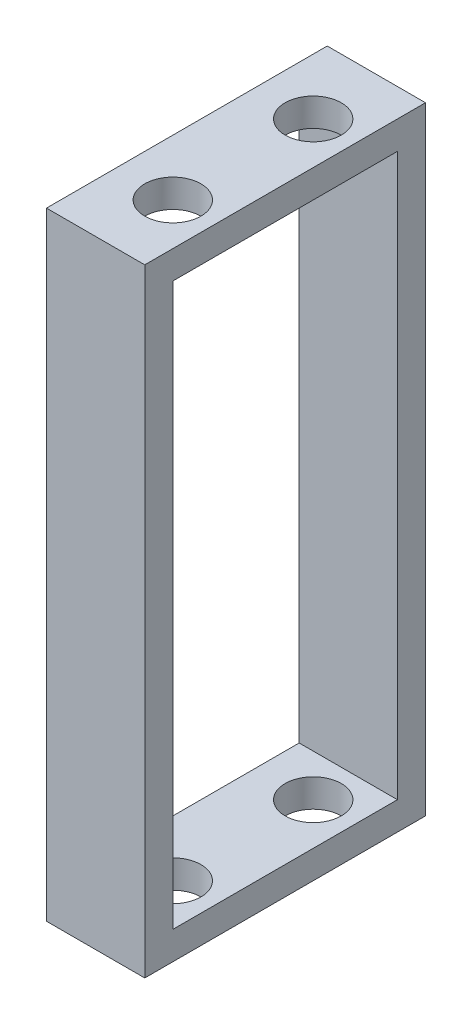
ISO-10303-21;
HEADER;
FILE_DESCRIPTION(('STEP AP214'),'2;1');
FILE_NAME('part.step','',(''),(''),'','','');
FILE_SCHEMA(('AUTOMOTIVE_DESIGN { 1 0 10303 214 1 1 1 1 }'));
ENDSEC;
DATA;
#1=APPLICATION_CONTEXT('core data for automotive mechanical design processes');
#2=APPLICATION_PROTOCOL_DEFINITION('international standard','automotive_design',2000,#1);
#3=PRODUCT_CONTEXT('',#1,'mechanical');
#4=PRODUCT('Part','Part','',(#3));
#5=PRODUCT_RELATED_PRODUCT_CATEGORY('part','',(#4));
#6=PRODUCT_DEFINITION_FORMATION('','',#4);
#7=PRODUCT_DEFINITION_CONTEXT('part definition',#1,'design');
#8=PRODUCT_DEFINITION('design','',#6,#7);
#9=PRODUCT_DEFINITION_SHAPE('','',#8);
#10=(LENGTH_UNIT() NAMED_UNIT(*) SI_UNIT(.MILLI.,.METRE.));
#11=(NAMED_UNIT(*) PLANE_ANGLE_UNIT() SI_UNIT($,.RADIAN.));
#12=(NAMED_UNIT(*) SI_UNIT($,.STERADIAN.) SOLID_ANGLE_UNIT());
#13=UNCERTAINTY_MEASURE_WITH_UNIT(LENGTH_MEASURE(1.E-05),#10,'distance_accuracy_value','');
#14=(GEOMETRIC_REPRESENTATION_CONTEXT(3) GLOBAL_UNCERTAINTY_ASSIGNED_CONTEXT((#13)) GLOBAL_UNIT_ASSIGNED_CONTEXT((#10,
#11,#12)) REPRESENTATION_CONTEXT('',''));
#15=CARTESIAN_POINT('',(0.,0.,0.));
#16=DIRECTION('',(0.,0.,1.));
#17=DIRECTION('',(1.,0.,0.));
#18=AXIS2_PLACEMENT_3D('',#15,#16,#17);
#19=CARTESIAN_POINT('',(7.,44.,10.));
#20=DIRECTION('',(0.,-1.,0.));
#21=DIRECTION('',(0.,0.,-1.));
#22=AXIS2_PLACEMENT_3D('',#19,#20,#21);
#23=PLANE('',#22);
#24=CARTESIAN_POINT('',(4.,44.,-5.));
#25=DIRECTION('',(0.,1.,0.));
#26=DIRECTION('',(0.,0.,1.));
#27=AXIS2_PLACEMENT_3D('',#24,#25,#26);
#28=CIRCLE('',#27,2.);
#29=CARTESIAN_POINT('',(4.,44.,-3.));
#30=VERTEX_POINT('',#29);
#31=EDGE_CURVE('E163',#30,#30,#28,.T.);
#32=ORIENTED_EDGE('',*,*,#31,.F.);
#33=EDGE_LOOP('',(#32));
#34=FACE_BOUND('',#33,.T.);
#35=CARTESIAN_POINT('',(4.,44.,5.));
#36=DIRECTION('',(0.,1.,0.));
#37=DIRECTION('',(0.,0.,1.));
#38=AXIS2_PLACEMENT_3D('',#35,#36,#37);
#39=CIRCLE('',#38,2.);
#40=CARTESIAN_POINT('',(4.,44.,7.));
#41=VERTEX_POINT('',#40);
#42=EDGE_CURVE('E170',#41,#41,#39,.T.);
#43=ORIENTED_EDGE('',*,*,#42,.F.);
#44=EDGE_LOOP('',(#43));
#45=FACE_BOUND('',#44,.T.);
#46=DIRECTION('',(-1.,0.,0.));
#47=VECTOR('',#46,1.);
#48=CARTESIAN_POINT('',(7.,44.,-10.));
#49=LINE('',#48,#47);
#50=CARTESIAN_POINT('',(7.,44.,-10.));
#51=VERTEX_POINT('',#50);
#52=CARTESIAN_POINT('',(0.,44.,-10.));
#53=VERTEX_POINT('',#52);
#54=EDGE_CURVE('E120',#51,#53,#49,.T.);
#55=ORIENTED_EDGE('',*,*,#54,.T.);
#56=DIRECTION('',(0.,0.,-1.));
#57=VECTOR('',#56,1.);
#58=CARTESIAN_POINT('',(0.,44.,10.));
#59=LINE('',#58,#57);
#60=CARTESIAN_POINT('',(0.,44.,10.));
#61=VERTEX_POINT('',#60);
#62=EDGE_CURVE('E151',#61,#53,#59,.T.);
#63=ORIENTED_EDGE('',*,*,#62,.F.);
#64=DIRECTION('',(-1.,0.,0.));
#65=VECTOR('',#64,1.);
#66=CARTESIAN_POINT('',(7.,44.,10.));
#67=LINE('',#66,#65);
#68=CARTESIAN_POINT('',(7.,44.,10.));
#69=VERTEX_POINT('',#68);
#70=EDGE_CURVE('E128',#69,#61,#67,.T.);
#71=ORIENTED_EDGE('',*,*,#70,.F.);
#72=DIRECTION('',(0.,0.,-1.));
#73=VECTOR('',#72,1.);
#74=CARTESIAN_POINT('',(7.,44.,10.));
#75=LINE('',#74,#73);
#76=EDGE_CURVE('E137',#69,#51,#75,.T.);
#77=ORIENTED_EDGE('',*,*,#76,.T.);
#78=EDGE_LOOP('',(#55,#63,#71,#77));
#79=FACE_BOUND('',#78,.T.);
#80=ADVANCED_FACE('F37',(#34,#45,#79),#23,.F.);
#81=CARTESIAN_POINT('',(0.,2.,10.));
#82=DIRECTION('',(1.,0.,0.));
#83=DIRECTION('',(0.,0.,-1.));
#84=AXIS2_PLACEMENT_3D('',#81,#82,#83);
#85=PLANE('',#84);
#86=DIRECTION('',(0.,0.,-1.));
#87=VECTOR('',#86,1.);
#88=CARTESIAN_POINT('',(0.,2.,10.));
#89=LINE('',#88,#87);
#90=CARTESIAN_POINT('',(0.,2.,8.));
#91=VERTEX_POINT('',#90);
#92=CARTESIAN_POINT('',(0.,2.,-8.00000000000001));
#93=VERTEX_POINT('',#92);
#94=EDGE_CURVE('E119',#91,#93,#89,.T.);
#95=ORIENTED_EDGE('',*,*,#94,.T.);
#96=DIRECTION('',(0.,1.,0.));
#97=VECTOR('',#96,1.);
#98=CARTESIAN_POINT('',(0.,2.00000000000001,-8.00000000000001));
#99=LINE('',#98,#97);
#100=CARTESIAN_POINT('',(0.,42.,-8.));
#101=VERTEX_POINT('',#100);
#102=EDGE_CURVE('E111',#93,#101,#99,.T.);
#103=ORIENTED_EDGE('',*,*,#102,.T.);
#104=DIRECTION('',(0.,0.,1.));
#105=VECTOR('',#104,1.);
#106=CARTESIAN_POINT('',(0.,42.,10.));
#107=LINE('',#106,#105);
#108=CARTESIAN_POINT('',(0.,42.,8.00000000000001));
#109=VERTEX_POINT('',#108);
#110=EDGE_CURVE('E100',#101,#109,#107,.T.);
#111=ORIENTED_EDGE('',*,*,#110,.T.);
#112=DIRECTION('',(0.,-1.,0.));
#113=VECTOR('',#112,1.);
#114=CARTESIAN_POINT('',(0.,2.,8.));
#115=LINE('',#114,#113);
#116=EDGE_CURVE('E105',#109,#91,#115,.T.);
#117=ORIENTED_EDGE('',*,*,#116,.T.);
#118=EDGE_LOOP('',(#95,#103,#111,#117));
#119=FACE_BOUND('',#118,.T.);
#120=DIRECTION('',(0.,-1.,0.));
#121=VECTOR('',#120,1.);
#122=CARTESIAN_POINT('',(0.,2.,-10.));
#123=LINE('',#122,#121);
#124=CARTESIAN_POINT('',(0.,0.,-10.));
#125=VERTEX_POINT('',#124);
#126=EDGE_CURVE('E123',#53,#125,#123,.T.);
#127=ORIENTED_EDGE('',*,*,#126,.T.);
#128=DIRECTION('',(0.,0.,-1.));
#129=VECTOR('',#128,1.);
#130=CARTESIAN_POINT('',(0.,0.,10.));
#131=LINE('',#130,#129);
#132=CARTESIAN_POINT('',(0.,0.,10.));
#133=VERTEX_POINT('',#132);
#134=EDGE_CURVE('E148',#133,#125,#131,.T.);
#135=ORIENTED_EDGE('',*,*,#134,.F.);
#136=DIRECTION('',(0.,-1.,0.));
#137=VECTOR('',#136,1.);
#138=CARTESIAN_POINT('',(0.,44.,10.));
#139=LINE('',#138,#137);
#140=EDGE_CURVE('E131',#61,#133,#139,.T.);
#141=ORIENTED_EDGE('',*,*,#140,.F.);
#142=ORIENTED_EDGE('',*,*,#62,.T.);
#143=EDGE_LOOP('',(#127,#135,#141,#142));
#144=FACE_BOUND('',#143,.T.);
#145=ADVANCED_FACE('F117',(#119,#144),#85,.F.);
#146=CARTESIAN_POINT('',(0.,0.,10.));
#147=DIRECTION('',(0.,1.,0.));
#148=DIRECTION('',(0.,0.,1.));
#149=AXIS2_PLACEMENT_3D('',#146,#147,#148);
#150=PLANE('',#149);
#151=CARTESIAN_POINT('',(4.,0.,-5.));
#152=DIRECTION('',(0.,1.,0.));
#153=DIRECTION('',(0.,0.,1.));
#154=AXIS2_PLACEMENT_3D('',#151,#152,#153);
#155=CIRCLE('',#154,2.);
#156=CARTESIAN_POINT('',(4.,0.,-3.));
#157=VERTEX_POINT('',#156);
#158=EDGE_CURVE('E114',#157,#157,#155,.T.);
#159=ORIENTED_EDGE('',*,*,#158,.T.);
#160=EDGE_LOOP('',(#159));
#161=FACE_BOUND('',#160,.T.);
#162=CARTESIAN_POINT('',(4.,0.,5.));
#163=DIRECTION('',(0.,1.,0.));
#164=DIRECTION('',(0.,0.,1.));
#165=AXIS2_PLACEMENT_3D('',#162,#163,#164);
#166=CIRCLE('',#165,2.);
#167=CARTESIAN_POINT('',(4.,0.,7.));
#168=VERTEX_POINT('',#167);
#169=EDGE_CURVE('E167',#168,#168,#166,.T.);
#170=ORIENTED_EDGE('',*,*,#169,.T.);
#171=EDGE_LOOP('',(#170));
#172=FACE_BOUND('',#171,.T.);
#173=DIRECTION('',(1.,0.,0.));
#174=VECTOR('',#173,1.);
#175=CARTESIAN_POINT('',(0.,0.,-10.));
#176=LINE('',#175,#174);
#177=CARTESIAN_POINT('',(7.,0.,-10.));
#178=VERTEX_POINT('',#177);
#179=EDGE_CURVE('E140',#125,#178,#176,.T.);
#180=ORIENTED_EDGE('',*,*,#179,.T.);
#181=DIRECTION('',(0.,0.,-1.));
#182=VECTOR('',#181,1.);
#183=CARTESIAN_POINT('',(7.,0.,10.));
#184=LINE('',#183,#182);
#185=CARTESIAN_POINT('',(7.,0.,10.));
#186=VERTEX_POINT('',#185);
#187=EDGE_CURVE('E145',#186,#178,#184,.T.);
#188=ORIENTED_EDGE('',*,*,#187,.F.);
#189=DIRECTION('',(1.,0.,0.));
#190=VECTOR('',#189,1.);
#191=CARTESIAN_POINT('',(0.,0.,10.));
#192=LINE('',#191,#190);
#193=EDGE_CURVE('E134',#133,#186,#192,.T.);
#194=ORIENTED_EDGE('',*,*,#193,.F.);
#195=ORIENTED_EDGE('',*,*,#134,.T.);
#196=EDGE_LOOP('',(#180,#188,#194,#195));
#197=FACE_BOUND('',#196,.T.);
#198=ADVANCED_FACE('F198',(#161,#172,#197),#150,.F.);
#199=CARTESIAN_POINT('',(7.,0.,10.));
#200=DIRECTION('',(-1.,0.,0.));
#201=DIRECTION('',(0.,-1.,0.));
#202=AXIS2_PLACEMENT_3D('',#199,#200,#201);
#203=PLANE('',#202);
#204=DIRECTION('',(0.,0.,-1.));
#205=VECTOR('',#204,1.);
#206=CARTESIAN_POINT('',(7.,42.,10.));
#207=LINE('',#206,#205);
#208=CARTESIAN_POINT('',(7.,42.,8.00000000000001));
#209=VERTEX_POINT('',#208);
#210=CARTESIAN_POINT('',(7.,42.,-7.99999999999999));
#211=VERTEX_POINT('',#210);
#212=EDGE_CURVE('E154',#209,#211,#207,.T.);
#213=ORIENTED_EDGE('',*,*,#212,.T.);
#214=DIRECTION('',(0.,-1.,0.));
#215=VECTOR('',#214,1.);
#216=CARTESIAN_POINT('',(7.,0.,-8.00000000000001));
#217=LINE('',#216,#215);
#218=CARTESIAN_POINT('',(7.,2.,-8.00000000000001));
#219=VERTEX_POINT('',#218);
#220=EDGE_CURVE('E11',#211,#219,#217,.T.);
#221=ORIENTED_EDGE('',*,*,#220,.T.);
#222=DIRECTION('',(0.,0.,1.));
#223=VECTOR('',#222,1.);
#224=CARTESIAN_POINT('',(7.,2.,10.));
#225=LINE('',#224,#223);
#226=CARTESIAN_POINT('',(7.,2.,8.));
#227=VERTEX_POINT('',#226);
#228=EDGE_CURVE('E45',#219,#227,#225,.T.);
#229=ORIENTED_EDGE('',*,*,#228,.T.);
#230=DIRECTION('',(0.,1.,0.));
#231=VECTOR('',#230,1.);
#232=CARTESIAN_POINT('',(7.,0.,8.));
#233=LINE('',#232,#231);
#234=EDGE_CURVE('E156',#227,#209,#233,.T.);
#235=ORIENTED_EDGE('',*,*,#234,.T.);
#236=EDGE_LOOP('',(#213,#221,#229,#235));
#237=FACE_BOUND('',#236,.T.);
#238=DIRECTION('',(0.,1.,0.));
#239=VECTOR('',#238,1.);
#240=CARTESIAN_POINT('',(7.,0.,-10.));
#241=LINE('',#240,#239);
#242=EDGE_CURVE('E132',#178,#51,#241,.T.);
#243=ORIENTED_EDGE('',*,*,#242,.T.);
#244=ORIENTED_EDGE('',*,*,#76,.F.);
#245=DIRECTION('',(0.,1.,0.));
#246=VECTOR('',#245,1.);
#247=CARTESIAN_POINT('',(7.,0.,10.));
#248=LINE('',#247,#246);
#249=EDGE_CURVE('E136',#186,#69,#248,.T.);
#250=ORIENTED_EDGE('',*,*,#249,.F.);
#251=ORIENTED_EDGE('',*,*,#187,.T.);
#252=EDGE_LOOP('',(#243,#244,#250,#251));
#253=FACE_BOUND('',#252,.T.);
#254=ADVANCED_FACE('F194',(#237,#253),#203,.F.);
#255=CARTESIAN_POINT('',(0.,0.,10.));
#256=DIRECTION('',(0.,0.,1.));
#257=DIRECTION('',(1.,0.,0.));
#258=AXIS2_PLACEMENT_3D('',#255,#256,#257);
#259=PLANE('',#258);
#260=ORIENTED_EDGE('',*,*,#70,.T.);
#261=ORIENTED_EDGE('',*,*,#140,.T.);
#262=ORIENTED_EDGE('',*,*,#193,.T.);
#263=ORIENTED_EDGE('',*,*,#249,.T.);
#264=EDGE_LOOP('',(#260,#261,#262,#263));
#265=FACE_BOUND('',#264,.T.);
#266=ADVANCED_FACE('F197',(#265),#259,.T.);
#267=CARTESIAN_POINT('',(0.,0.,-10.));
#268=DIRECTION('',(0.,0.,1.));
#269=DIRECTION('',(1.,0.,0.));
#270=AXIS2_PLACEMENT_3D('',#267,#268,#269);
#271=PLANE('',#270);
#272=ORIENTED_EDGE('',*,*,#54,.F.);
#273=ORIENTED_EDGE('',*,*,#242,.F.);
#274=ORIENTED_EDGE('',*,*,#179,.F.);
#275=ORIENTED_EDGE('',*,*,#126,.F.);
#276=EDGE_LOOP('',(#272,#273,#274,#275));
#277=FACE_BOUND('',#276,.T.);
#278=ADVANCED_FACE('F210',(#277),#271,.F.);
#279=CARTESIAN_POINT('',(-3.,42.,-8.));
#280=DIRECTION('',(0.,0.,-1.));
#281=DIRECTION('',(0.,1.,0.));
#282=AXIS2_PLACEMENT_3D('',#279,#280,#281);
#283=PLANE('',#282);
#284=DIRECTION('',(1.,0.,0.));
#285=VECTOR('',#284,1.);
#286=CARTESIAN_POINT('',(-3.,2.,-8.00000000000001));
#287=LINE('',#286,#285);
#288=EDGE_CURVE('E106',#93,#219,#287,.T.);
#289=ORIENTED_EDGE('',*,*,#288,.T.);
#290=ORIENTED_EDGE('',*,*,#220,.F.);
#291=DIRECTION('',(1.,0.,0.));
#292=VECTOR('',#291,1.);
#293=CARTESIAN_POINT('',(-3.,42.,-8.));
#294=LINE('',#293,#292);
#295=EDGE_CURVE('E58',#101,#211,#294,.T.);
#296=ORIENTED_EDGE('',*,*,#295,.F.);
#297=ORIENTED_EDGE('',*,*,#102,.F.);
#298=EDGE_LOOP('',(#289,#290,#296,#297));
#299=FACE_BOUND('',#298,.T.);
#300=ADVANCED_FACE('F110',(#299),#283,.F.);
#301=CARTESIAN_POINT('',(-3.,2.,8.));
#302=DIRECTION('',(0.,-1.,0.));
#303=DIRECTION('',(1.,0.,0.));
#304=AXIS2_PLACEMENT_3D('',#301,#302,#303);
#305=PLANE('',#304);
#306=CARTESIAN_POINT('',(4.,2.,-5.));
#307=DIRECTION('',(0.,-1.,0.));
#308=DIRECTION('',(1.,0.,0.));
#309=AXIS2_PLACEMENT_3D('',#306,#307,#308);
#310=CIRCLE('',#309,2.);
#311=CARTESIAN_POINT('',(6.,2.,-5.));
#312=VERTEX_POINT('',#311);
#313=EDGE_CURVE('E179',#312,#312,#310,.T.);
#314=ORIENTED_EDGE('',*,*,#313,.T.);
#315=EDGE_LOOP('',(#314));
#316=FACE_BOUND('',#315,.T.);
#317=CARTESIAN_POINT('',(4.,2.,5.));
#318=DIRECTION('',(0.,-1.,0.));
#319=DIRECTION('',(1.,0.,0.));
#320=AXIS2_PLACEMENT_3D('',#317,#318,#319);
#321=CIRCLE('',#320,2.);
#322=CARTESIAN_POINT('',(6.,2.,5.));
#323=VERTEX_POINT('',#322);
#324=EDGE_CURVE('E162',#323,#323,#321,.T.);
#325=ORIENTED_EDGE('',*,*,#324,.T.);
#326=EDGE_LOOP('',(#325));
#327=FACE_BOUND('',#326,.T.);
#328=DIRECTION('',(1.,0.,0.));
#329=VECTOR('',#328,1.);
#330=CARTESIAN_POINT('',(-3.,2.,8.));
#331=LINE('',#330,#329);
#332=EDGE_CURVE('E185',#91,#227,#331,.T.);
#333=ORIENTED_EDGE('',*,*,#332,.T.);
#334=ORIENTED_EDGE('',*,*,#228,.F.);
#335=ORIENTED_EDGE('',*,*,#288,.F.);
#336=ORIENTED_EDGE('',*,*,#94,.F.);
#337=EDGE_LOOP('',(#333,#334,#335,#336));
#338=FACE_BOUND('',#337,.T.);
#339=ADVANCED_FACE('F192',(#316,#327,#338),#305,.F.);
#340=CARTESIAN_POINT('',(-3.,42.,8.00000000000001));
#341=DIRECTION('',(0.,0.,1.));
#342=DIRECTION('',(0.,-1.,0.));
#343=AXIS2_PLACEMENT_3D('',#340,#341,#342);
#344=PLANE('',#343);
#345=DIRECTION('',(1.,0.,0.));
#346=VECTOR('',#345,1.);
#347=CARTESIAN_POINT('',(-3.,42.,8.00000000000001));
#348=LINE('',#347,#346);
#349=EDGE_CURVE('E53',#109,#209,#348,.T.);
#350=ORIENTED_EDGE('',*,*,#349,.T.);
#351=ORIENTED_EDGE('',*,*,#234,.F.);
#352=ORIENTED_EDGE('',*,*,#332,.F.);
#353=ORIENTED_EDGE('',*,*,#116,.F.);
#354=EDGE_LOOP('',(#350,#351,#352,#353));
#355=FACE_BOUND('',#354,.T.);
#356=ADVANCED_FACE('F190',(#355),#344,.F.);
#357=CARTESIAN_POINT('',(-3.,42.,8.00000000000001));
#358=DIRECTION('',(0.,1.,0.));
#359=DIRECTION('',(-1.,0.,0.));
#360=AXIS2_PLACEMENT_3D('',#357,#358,#359);
#361=PLANE('',#360);
#362=CARTESIAN_POINT('',(4.,42.,-5.));
#363=DIRECTION('',(0.,1.,0.));
#364=DIRECTION('',(-1.,0.,0.));
#365=AXIS2_PLACEMENT_3D('',#362,#363,#364);
#366=CIRCLE('',#365,2.);
#367=CARTESIAN_POINT('',(2.,42.,-5.));
#368=VERTEX_POINT('',#367);
#369=EDGE_CURVE('E40',#368,#368,#366,.T.);
#370=ORIENTED_EDGE('',*,*,#369,.T.);
#371=EDGE_LOOP('',(#370));
#372=FACE_BOUND('',#371,.T.);
#373=CARTESIAN_POINT('',(4.,42.,5.));
#374=DIRECTION('',(0.,1.,0.));
#375=DIRECTION('',(-1.,0.,0.));
#376=AXIS2_PLACEMENT_3D('',#373,#374,#375);
#377=CIRCLE('',#376,2.);
#378=CARTESIAN_POINT('',(2.,42.,5.));
#379=VERTEX_POINT('',#378);
#380=EDGE_CURVE('E160',#379,#379,#377,.T.);
#381=ORIENTED_EDGE('',*,*,#380,.T.);
#382=EDGE_LOOP('',(#381));
#383=FACE_BOUND('',#382,.T.);
#384=ORIENTED_EDGE('',*,*,#295,.T.);
#385=ORIENTED_EDGE('',*,*,#212,.F.);
#386=ORIENTED_EDGE('',*,*,#349,.F.);
#387=ORIENTED_EDGE('',*,*,#110,.F.);
#388=EDGE_LOOP('',(#384,#385,#386,#387));
#389=FACE_BOUND('',#388,.T.);
#390=ADVANCED_FACE('F101',(#372,#383,#389),#361,.F.);
#391=CARTESIAN_POINT('',(4.,-6.,5.));
#392=DIRECTION('',(0.,1.,0.));
#393=DIRECTION('',(0.,0.,1.));
#394=AXIS2_PLACEMENT_3D('',#391,#392,#393);
#395=CYLINDRICAL_SURFACE('',#394,2.);
#396=ORIENTED_EDGE('',*,*,#42,.T.);
#397=EDGE_LOOP('',(#396));
#398=FACE_BOUND('',#397,.T.);
#399=ORIENTED_EDGE('',*,*,#380,.F.);
#400=EDGE_LOOP('',(#399));
#401=FACE_BOUND('',#400,.T.);
#402=ADVANCED_FACE('F229',(#398,#401),#395,.F.);
#403=CARTESIAN_POINT('',(4.,-6.,-5.));
#404=DIRECTION('',(0.,1.,0.));
#405=DIRECTION('',(0.,0.,1.));
#406=AXIS2_PLACEMENT_3D('',#403,#404,#405);
#407=CYLINDRICAL_SURFACE('',#406,2.);
#408=ORIENTED_EDGE('',*,*,#31,.T.);
#409=EDGE_LOOP('',(#408));
#410=FACE_BOUND('',#409,.T.);
#411=ORIENTED_EDGE('',*,*,#369,.F.);
#412=EDGE_LOOP('',(#411));
#413=FACE_BOUND('',#412,.T.);
#414=ADVANCED_FACE('F232',(#410,#413),#407,.F.);
#415=ORIENTED_EDGE('',*,*,#324,.F.);
#416=EDGE_LOOP('',(#415));
#417=FACE_BOUND('',#416,.T.);
#418=ORIENTED_EDGE('',*,*,#169,.F.);
#419=EDGE_LOOP('',(#418));
#420=FACE_BOUND('',#419,.T.);
#421=ADVANCED_FACE('F234',(#417,#420),#395,.F.);
#422=ORIENTED_EDGE('',*,*,#313,.F.);
#423=EDGE_LOOP('',(#422));
#424=FACE_BOUND('',#423,.T.);
#425=ORIENTED_EDGE('',*,*,#158,.F.);
#426=EDGE_LOOP('',(#425));
#427=FACE_BOUND('',#426,.T.);
#428=ADVANCED_FACE('F240',(#424,#427),#407,.F.);
#429=CLOSED_SHELL('',(#80,#145,#198,#254,#266,#278,#300,#339,#356,#390,#402,#414,#421,#428));
#430=MANIFOLD_SOLID_BREP('B2',#429);
#431=ADVANCED_BREP_SHAPE_REPRESENTATION('',(#18,#430),#14);
#432=SHAPE_DEFINITION_REPRESENTATION(#9,#431);
ENDSEC;
END-ISO-10303-21;
